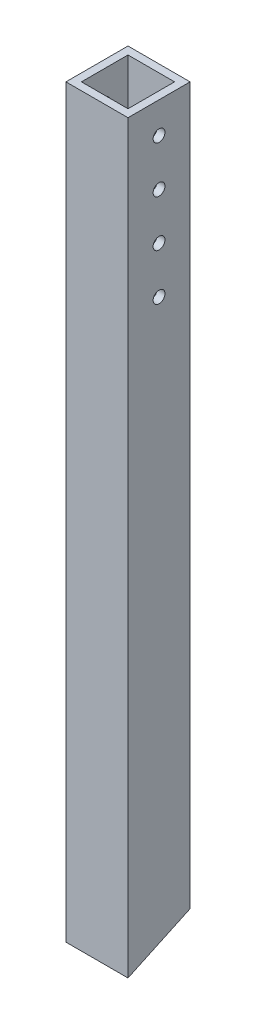
ISO-10303-21;
HEADER;
FILE_DESCRIPTION(('STEP AP214'),'2;1');
FILE_NAME('part.step','',(''),(''),'','','');
FILE_SCHEMA(('AUTOMOTIVE_DESIGN { 1 0 10303 214 1 1 1 1 }'));
ENDSEC;
DATA;
#1=APPLICATION_CONTEXT('core data for automotive mechanical design processes');
#2=APPLICATION_PROTOCOL_DEFINITION('international standard','automotive_design',2000,#1);
#3=PRODUCT_CONTEXT('',#1,'mechanical');
#4=PRODUCT('Part','Part','',(#3));
#5=PRODUCT_RELATED_PRODUCT_CATEGORY('part','',(#4));
#6=PRODUCT_DEFINITION_FORMATION('','',#4);
#7=PRODUCT_DEFINITION_CONTEXT('part definition',#1,'design');
#8=PRODUCT_DEFINITION('design','',#6,#7);
#9=PRODUCT_DEFINITION_SHAPE('','',#8);
#10=(LENGTH_UNIT() NAMED_UNIT(*) SI_UNIT(.MILLI.,.METRE.));
#11=(NAMED_UNIT(*) PLANE_ANGLE_UNIT() SI_UNIT($,.RADIAN.));
#12=(NAMED_UNIT(*) SI_UNIT($,.STERADIAN.) SOLID_ANGLE_UNIT());
#13=UNCERTAINTY_MEASURE_WITH_UNIT(LENGTH_MEASURE(1.E-05),#10,'distance_accuracy_value','');
#14=(GEOMETRIC_REPRESENTATION_CONTEXT(3) GLOBAL_UNCERTAINTY_ASSIGNED_CONTEXT((#13)) GLOBAL_UNIT_ASSIGNED_CONTEXT((#10,
#11,#12)) REPRESENTATION_CONTEXT('',''));
#15=CARTESIAN_POINT('',(0.,0.,0.));
#16=DIRECTION('',(0.,0.,1.));
#17=DIRECTION('',(1.,0.,0.));
#18=AXIS2_PLACEMENT_3D('',#15,#16,#17);
#19=CARTESIAN_POINT('',(12.7,304.8,-12.7));
#20=DIRECTION('',(0.,-1.,0.));
#21=DIRECTION('',(0.,0.,-1.));
#22=AXIS2_PLACEMENT_3D('',#19,#20,#21);
#23=PLANE('',#22);
#24=DIRECTION('',(0.,0.,-1.));
#25=VECTOR('',#24,1.);
#26=CARTESIAN_POINT('',(12.7,304.8,12.7));
#27=LINE('',#26,#25);
#28=CARTESIAN_POINT('',(12.7,304.8,12.7));
#29=VERTEX_POINT('',#28);
#30=CARTESIAN_POINT('',(12.7,304.8,-12.7));
#31=VERTEX_POINT('',#30);
#32=EDGE_CURVE('E192',#29,#31,#27,.T.);
#33=ORIENTED_EDGE('',*,*,#32,.T.);
#34=DIRECTION('',(-1.,0.,0.));
#35=VECTOR('',#34,1.);
#36=CARTESIAN_POINT('',(-12.7,304.8,-12.7));
#37=LINE('',#36,#35);
#38=CARTESIAN_POINT('',(-12.7,304.8,-12.7));
#39=VERTEX_POINT('',#38);
#40=EDGE_CURVE('E195',#31,#39,#37,.T.);
#41=ORIENTED_EDGE('',*,*,#40,.T.);
#42=DIRECTION('',(0.,0.,1.));
#43=VECTOR('',#42,1.);
#44=CARTESIAN_POINT('',(-12.7,304.8,12.7));
#45=LINE('',#44,#43);
#46=CARTESIAN_POINT('',(-12.7,304.8,12.7));
#47=VERTEX_POINT('',#46);
#48=EDGE_CURVE('E118',#39,#47,#45,.T.);
#49=ORIENTED_EDGE('',*,*,#48,.T.);
#50=DIRECTION('',(1.,0.,0.));
#51=VECTOR('',#50,1.);
#52=CARTESIAN_POINT('',(-12.7,304.8,12.7));
#53=LINE('',#52,#51);
#54=EDGE_CURVE('E198',#47,#29,#53,.T.);
#55=ORIENTED_EDGE('',*,*,#54,.T.);
#56=EDGE_LOOP('',(#33,#41,#49,#55));
#57=FACE_BOUND('',#56,.T.);
#58=DIRECTION('',(1.,0.,0.));
#59=VECTOR('',#58,1.);
#60=CARTESIAN_POINT('',(-9.525,304.8,9.525));
#61=LINE('',#60,#59);
#62=CARTESIAN_POINT('',(-9.525,304.8,9.525));
#63=VERTEX_POINT('',#62);
#64=CARTESIAN_POINT('',(9.525,304.8,9.525));
#65=VERTEX_POINT('',#64);
#66=EDGE_CURVE('E174',#63,#65,#61,.T.);
#67=ORIENTED_EDGE('',*,*,#66,.F.);
#68=DIRECTION('',(0.,0.,1.));
#69=VECTOR('',#68,1.);
#70=CARTESIAN_POINT('',(-9.525,304.8,9.525));
#71=LINE('',#70,#69);
#72=CARTESIAN_POINT('',(-9.525,304.8,-9.525));
#73=VERTEX_POINT('',#72);
#74=EDGE_CURVE('E180',#73,#63,#71,.T.);
#75=ORIENTED_EDGE('',*,*,#74,.F.);
#76=DIRECTION('',(-1.,0.,0.));
#77=VECTOR('',#76,1.);
#78=CARTESIAN_POINT('',(-9.525,304.8,-9.525));
#79=LINE('',#78,#77);
#80=CARTESIAN_POINT('',(9.525,304.8,-9.525));
#81=VERTEX_POINT('',#80);
#82=EDGE_CURVE('E178',#81,#73,#79,.T.);
#83=ORIENTED_EDGE('',*,*,#82,.F.);
#84=DIRECTION('',(0.,0.,-1.));
#85=VECTOR('',#84,1.);
#86=CARTESIAN_POINT('',(9.525,304.8,9.525));
#87=LINE('',#86,#85);
#88=EDGE_CURVE('E176',#65,#81,#87,.T.);
#89=ORIENTED_EDGE('',*,*,#88,.F.);
#90=EDGE_LOOP('',(#67,#75,#83,#89));
#91=FACE_BOUND('',#90,.T.);
#92=ADVANCED_FACE('F31',(#57,#91),#23,.F.);
#93=CARTESIAN_POINT('',(12.7,304.8,12.7));
#94=DIRECTION('',(-1.,0.,0.));
#95=DIRECTION('',(0.,0.,1.));
#96=AXIS2_PLACEMENT_3D('',#93,#94,#95);
#97=PLANE('',#96);
#98=CARTESIAN_POINT('',(12.7,234.95,0.));
#99=DIRECTION('',(1.,0.,0.));
#100=DIRECTION('',(0.,0.,-1.));
#101=AXIS2_PLACEMENT_3D('',#98,#99,#100);
#102=CIRCLE('',#101,2.41300000000001);
#103=CARTESIAN_POINT('',(12.7,234.95,-2.41300000000001));
#104=VERTEX_POINT('',#103);
#105=EDGE_CURVE('E257',#104,#104,#102,.T.);
#106=ORIENTED_EDGE('',*,*,#105,.F.);
#107=EDGE_LOOP('',(#106));
#108=FACE_BOUND('',#107,.T.);
#109=CARTESIAN_POINT('',(12.7,254.,0.));
#110=DIRECTION('',(1.,0.,0.));
#111=DIRECTION('',(0.,0.,-1.));
#112=AXIS2_PLACEMENT_3D('',#109,#110,#111);
#113=CIRCLE('',#112,2.41300000000001);
#114=CARTESIAN_POINT('',(12.7,254.,-2.41300000000001));
#115=VERTEX_POINT('',#114);
#116=EDGE_CURVE('E145',#115,#115,#113,.T.);
#117=ORIENTED_EDGE('',*,*,#116,.F.);
#118=EDGE_LOOP('',(#117));
#119=FACE_BOUND('',#118,.T.);
#120=CARTESIAN_POINT('',(12.7,273.05,0.));
#121=DIRECTION('',(1.,0.,0.));
#122=DIRECTION('',(0.,0.,-1.));
#123=AXIS2_PLACEMENT_3D('',#120,#121,#122);
#124=CIRCLE('',#123,2.41300000000001);
#125=CARTESIAN_POINT('',(12.7,273.05,-2.41300000000001));
#126=VERTEX_POINT('',#125);
#127=EDGE_CURVE('E142',#126,#126,#124,.T.);
#128=ORIENTED_EDGE('',*,*,#127,.F.);
#129=EDGE_LOOP('',(#128));
#130=FACE_BOUND('',#129,.T.);
#131=CARTESIAN_POINT('',(12.7,292.1,0.));
#132=DIRECTION('',(1.,0.,0.));
#133=DIRECTION('',(0.,0.,-1.));
#134=AXIS2_PLACEMENT_3D('',#131,#132,#133);
#135=CIRCLE('',#134,2.41300000000001);
#136=CARTESIAN_POINT('',(12.7,292.1,-2.41300000000001));
#137=VERTEX_POINT('',#136);
#138=EDGE_CURVE('E167',#137,#137,#135,.T.);
#139=ORIENTED_EDGE('',*,*,#138,.F.);
#140=EDGE_LOOP('',(#139));
#141=FACE_BOUND('',#140,.T.);
#142=DIRECTION('',(0.,-1.,0.));
#143=VECTOR('',#142,1.);
#144=CARTESIAN_POINT('',(12.7,304.8,12.7));
#145=LINE('',#144,#143);
#146=CARTESIAN_POINT('',(12.7,0.,12.7));
#147=VERTEX_POINT('',#146);
#148=EDGE_CURVE('E122',#29,#147,#145,.T.);
#149=ORIENTED_EDGE('',*,*,#148,.T.);
#150=DIRECTION('',(0.,-0.422618261740695,0.906307787036652));
#151=VECTOR('',#150,1.);
#152=CARTESIAN_POINT('',(12.7,0.,12.7));
#153=LINE('',#152,#151);
#154=CARTESIAN_POINT('',(12.7,11.8442145171368,-12.7));
#155=VERTEX_POINT('',#154);
#156=EDGE_CURVE('E107',#155,#147,#153,.T.);
#157=ORIENTED_EDGE('',*,*,#156,.F.);
#158=DIRECTION('',(0.,-1.,0.));
#159=VECTOR('',#158,1.);
#160=CARTESIAN_POINT('',(12.7,304.8,-12.7));
#161=LINE('',#160,#159);
#162=EDGE_CURVE('E40',#31,#155,#161,.T.);
#163=ORIENTED_EDGE('',*,*,#162,.F.);
#164=ORIENTED_EDGE('',*,*,#32,.F.);
#165=EDGE_LOOP('',(#149,#157,#163,#164));
#166=FACE_BOUND('',#165,.T.);
#167=ADVANCED_FACE('F33',(#108,#119,#130,#141,#166),#97,.F.);
#168=CARTESIAN_POINT('',(-12.7,304.8,-12.7));
#169=DIRECTION('',(0.,0.,1.));
#170=DIRECTION('',(1.,0.,0.));
#171=AXIS2_PLACEMENT_3D('',#168,#169,#170);
#172=PLANE('',#171);
#173=ORIENTED_EDGE('',*,*,#162,.T.);
#174=DIRECTION('',(1.,0.,0.));
#175=VECTOR('',#174,1.);
#176=CARTESIAN_POINT('',(-12.7,11.8442145171368,-12.7));
#177=LINE('',#176,#175);
#178=CARTESIAN_POINT('',(-12.7,11.8442145171368,-12.7));
#179=VERTEX_POINT('',#178);
#180=EDGE_CURVE('E99',#179,#155,#177,.T.);
#181=ORIENTED_EDGE('',*,*,#180,.F.);
#182=DIRECTION('',(0.,-1.,0.));
#183=VECTOR('',#182,1.);
#184=CARTESIAN_POINT('',(-12.7,304.8,-12.7));
#185=LINE('',#184,#183);
#186=EDGE_CURVE('E113',#39,#179,#185,.T.);
#187=ORIENTED_EDGE('',*,*,#186,.F.);
#188=ORIENTED_EDGE('',*,*,#40,.F.);
#189=EDGE_LOOP('',(#173,#181,#187,#188));
#190=FACE_BOUND('',#189,.T.);
#191=ADVANCED_FACE('F112',(#190),#172,.F.);
#192=CARTESIAN_POINT('',(-12.7,304.8,12.7));
#193=DIRECTION('',(1.,0.,0.));
#194=DIRECTION('',(0.,0.,-1.));
#195=AXIS2_PLACEMENT_3D('',#192,#193,#194);
#196=PLANE('',#195);
#197=CARTESIAN_POINT('',(-12.7,234.95,0.));
#198=DIRECTION('',(1.,0.,0.));
#199=DIRECTION('',(0.,0.,-1.));
#200=AXIS2_PLACEMENT_3D('',#197,#198,#199);
#201=CIRCLE('',#200,2.41300000000001);
#202=CARTESIAN_POINT('',(-12.7,234.95,-2.41300000000001));
#203=VERTEX_POINT('',#202);
#204=EDGE_CURVE('E298',#203,#203,#201,.T.);
#205=ORIENTED_EDGE('',*,*,#204,.T.);
#206=EDGE_LOOP('',(#205));
#207=FACE_BOUND('',#206,.T.);
#208=CARTESIAN_POINT('',(-12.7,254.,0.));
#209=DIRECTION('',(1.,0.,0.));
#210=DIRECTION('',(0.,0.,-1.));
#211=AXIS2_PLACEMENT_3D('',#208,#209,#210);
#212=CIRCLE('',#211,2.41300000000001);
#213=CARTESIAN_POINT('',(-12.7,254.,-2.41300000000001));
#214=VERTEX_POINT('',#213);
#215=EDGE_CURVE('E138',#214,#214,#212,.T.);
#216=ORIENTED_EDGE('',*,*,#215,.T.);
#217=EDGE_LOOP('',(#216));
#218=FACE_BOUND('',#217,.T.);
#219=CARTESIAN_POINT('',(-12.7,273.05,0.));
#220=DIRECTION('',(1.,0.,0.));
#221=DIRECTION('',(0.,0.,-1.));
#222=AXIS2_PLACEMENT_3D('',#219,#220,#221);
#223=CIRCLE('',#222,2.41300000000001);
#224=CARTESIAN_POINT('',(-12.7,273.05,-2.41300000000001));
#225=VERTEX_POINT('',#224);
#226=EDGE_CURVE('E134',#225,#225,#223,.T.);
#227=ORIENTED_EDGE('',*,*,#226,.T.);
#228=EDGE_LOOP('',(#227));
#229=FACE_BOUND('',#228,.T.);
#230=CARTESIAN_POINT('',(-12.7,292.1,0.));
#231=DIRECTION('',(1.,0.,0.));
#232=DIRECTION('',(0.,0.,-1.));
#233=AXIS2_PLACEMENT_3D('',#230,#231,#232);
#234=CIRCLE('',#233,2.41300000000001);
#235=CARTESIAN_POINT('',(-12.7,292.1,-2.41300000000001));
#236=VERTEX_POINT('',#235);
#237=EDGE_CURVE('E129',#236,#236,#234,.T.);
#238=ORIENTED_EDGE('',*,*,#237,.T.);
#239=EDGE_LOOP('',(#238));
#240=FACE_BOUND('',#239,.T.);
#241=ORIENTED_EDGE('',*,*,#186,.T.);
#242=DIRECTION('',(0.,-0.422618261740695,0.906307787036652));
#243=VECTOR('',#242,1.);
#244=CARTESIAN_POINT('',(-12.7,0.,12.7));
#245=LINE('',#244,#243);
#246=CARTESIAN_POINT('',(-12.7,0.,12.7));
#247=VERTEX_POINT('',#246);
#248=EDGE_CURVE('E96',#179,#247,#245,.T.);
#249=ORIENTED_EDGE('',*,*,#248,.T.);
#250=DIRECTION('',(0.,-1.,0.));
#251=VECTOR('',#250,1.);
#252=CARTESIAN_POINT('',(-12.7,304.8,12.7));
#253=LINE('',#252,#251);
#254=EDGE_CURVE('E119',#47,#247,#253,.T.);
#255=ORIENTED_EDGE('',*,*,#254,.F.);
#256=ORIENTED_EDGE('',*,*,#48,.F.);
#257=EDGE_LOOP('',(#241,#249,#255,#256));
#258=FACE_BOUND('',#257,.T.);
#259=ADVANCED_FACE('F117',(#207,#218,#229,#240,#258),#196,.F.);
#260=CARTESIAN_POINT('',(-12.7,304.8,12.7));
#261=DIRECTION('',(0.,0.,-1.));
#262=DIRECTION('',(-1.,0.,0.));
#263=AXIS2_PLACEMENT_3D('',#260,#261,#262);
#264=PLANE('',#263);
#265=DIRECTION('',(1.,0.,0.));
#266=VECTOR('',#265,1.);
#267=CARTESIAN_POINT('',(-12.7,0.,12.7));
#268=LINE('',#267,#266);
#269=EDGE_CURVE('E102',#247,#147,#268,.T.);
#270=ORIENTED_EDGE('',*,*,#269,.T.);
#271=ORIENTED_EDGE('',*,*,#148,.F.);
#272=ORIENTED_EDGE('',*,*,#54,.F.);
#273=ORIENTED_EDGE('',*,*,#254,.T.);
#274=EDGE_LOOP('',(#270,#271,#272,#273));
#275=FACE_BOUND('',#274,.T.);
#276=ADVANCED_FACE('F206',(#275),#264,.F.);
#277=CARTESIAN_POINT('',(-9.525,304.8,9.525));
#278=DIRECTION('',(0.,0.,-1.));
#279=DIRECTION('',(-1.,0.,0.));
#280=AXIS2_PLACEMENT_3D('',#277,#278,#279);
#281=PLANE('',#280);
#282=DIRECTION('',(1.,0.,0.));
#283=VECTOR('',#282,1.);
#284=CARTESIAN_POINT('',(-9.525,1.48052681464211,9.525));
#285=LINE('',#284,#283);
#286=CARTESIAN_POINT('',(-9.525,1.48052681464209,9.52500000000001));
#287=VERTEX_POINT('',#286);
#288=CARTESIAN_POINT('',(9.525,1.48052681464209,9.52500000000001));
#289=VERTEX_POINT('',#288);
#290=EDGE_CURVE('E165',#287,#289,#285,.T.);
#291=ORIENTED_EDGE('',*,*,#290,.F.);
#292=DIRECTION('',(0.,-1.,0.));
#293=VECTOR('',#292,1.);
#294=CARTESIAN_POINT('',(-9.525,304.8,9.525));
#295=LINE('',#294,#293);
#296=EDGE_CURVE('E182',#63,#287,#295,.T.);
#297=ORIENTED_EDGE('',*,*,#296,.F.);
#298=ORIENTED_EDGE('',*,*,#66,.T.);
#299=DIRECTION('',(0.,-1.,0.));
#300=VECTOR('',#299,1.);
#301=CARTESIAN_POINT('',(9.525,304.8,9.525));
#302=LINE('',#301,#300);
#303=EDGE_CURVE('E189',#65,#289,#302,.T.);
#304=ORIENTED_EDGE('',*,*,#303,.T.);
#305=EDGE_LOOP('',(#291,#297,#298,#304));
#306=FACE_BOUND('',#305,.T.);
#307=ADVANCED_FACE('F219',(#306),#281,.T.);
#308=CARTESIAN_POINT('',(9.525,304.8,9.525));
#309=DIRECTION('',(-1.,0.,0.));
#310=DIRECTION('',(0.,0.,1.));
#311=AXIS2_PLACEMENT_3D('',#308,#309,#310);
#312=PLANE('',#311);
#313=CARTESIAN_POINT('',(9.525,234.95,0.));
#314=DIRECTION('',(-1.,0.,0.));
#315=DIRECTION('',(0.,0.,1.));
#316=AXIS2_PLACEMENT_3D('',#313,#314,#315);
#317=CIRCLE('',#316,2.41300000000001);
#318=CARTESIAN_POINT('',(9.525,234.95,2.41300000000002));
#319=VERTEX_POINT('',#318);
#320=EDGE_CURVE('E150',#319,#319,#317,.T.);
#321=ORIENTED_EDGE('',*,*,#320,.F.);
#322=EDGE_LOOP('',(#321));
#323=FACE_BOUND('',#322,.T.);
#324=CARTESIAN_POINT('',(9.525,254.,0.));
#325=DIRECTION('',(-1.,0.,0.));
#326=DIRECTION('',(0.,0.,1.));
#327=AXIS2_PLACEMENT_3D('',#324,#325,#326);
#328=CIRCLE('',#327,2.41300000000001);
#329=CARTESIAN_POINT('',(9.525,254.,2.41300000000002));
#330=VERTEX_POINT('',#329);
#331=EDGE_CURVE('E137',#330,#330,#328,.T.);
#332=ORIENTED_EDGE('',*,*,#331,.F.);
#333=EDGE_LOOP('',(#332));
#334=FACE_BOUND('',#333,.T.);
#335=CARTESIAN_POINT('',(9.525,273.05,0.));
#336=DIRECTION('',(-1.,0.,0.));
#337=DIRECTION('',(0.,0.,1.));
#338=AXIS2_PLACEMENT_3D('',#335,#336,#337);
#339=CIRCLE('',#338,2.41300000000001);
#340=CARTESIAN_POINT('',(9.525,273.05,2.41300000000001));
#341=VERTEX_POINT('',#340);
#342=EDGE_CURVE('E133',#341,#341,#339,.T.);
#343=ORIENTED_EDGE('',*,*,#342,.F.);
#344=EDGE_LOOP('',(#343));
#345=FACE_BOUND('',#344,.T.);
#346=DIRECTION('',(0.,0.422618261740695,-0.906307787036652));
#347=VECTOR('',#346,1.);
#348=CARTESIAN_POINT('',(9.525,55.6552638372215,-106.653098461709));
#349=LINE('',#348,#347);
#350=CARTESIAN_POINT('',(9.525,10.3636877024947,-9.525));
#351=VERTEX_POINT('',#350);
#352=EDGE_CURVE('E163',#289,#351,#349,.T.);
#353=ORIENTED_EDGE('',*,*,#352,.F.);
#354=ORIENTED_EDGE('',*,*,#303,.F.);
#355=ORIENTED_EDGE('',*,*,#88,.T.);
#356=DIRECTION('',(0.,-1.,0.));
#357=VECTOR('',#356,1.);
#358=CARTESIAN_POINT('',(9.525,304.8,-9.525));
#359=LINE('',#358,#357);
#360=EDGE_CURVE('E186',#81,#351,#359,.T.);
#361=ORIENTED_EDGE('',*,*,#360,.T.);
#362=EDGE_LOOP('',(#353,#354,#355,#361));
#363=FACE_BOUND('',#362,.T.);
#364=CARTESIAN_POINT('',(9.525,292.1,0.));
#365=DIRECTION('',(-1.,0.,0.));
#366=DIRECTION('',(0.,0.,1.));
#367=AXIS2_PLACEMENT_3D('',#364,#365,#366);
#368=CIRCLE('',#367,2.41300000000001);
#369=CARTESIAN_POINT('',(9.525,292.1,2.41300000000001));
#370=VERTEX_POINT('',#369);
#371=EDGE_CURVE('E128',#370,#370,#368,.T.);
#372=ORIENTED_EDGE('',*,*,#371,.F.);
#373=EDGE_LOOP('',(#372));
#374=FACE_BOUND('',#373,.T.);
#375=ADVANCED_FACE('F222',(#323,#334,#345,#363,#374),#312,.T.);
#376=CARTESIAN_POINT('',(-9.525,304.8,-9.525));
#377=DIRECTION('',(0.,0.,1.));
#378=DIRECTION('',(1.,0.,0.));
#379=AXIS2_PLACEMENT_3D('',#376,#377,#378);
#380=PLANE('',#379);
#381=DIRECTION('',(-1.,0.,0.));
#382=VECTOR('',#381,1.);
#383=CARTESIAN_POINT('',(-9.525,10.3636877024947,-9.525));
#384=LINE('',#383,#382);
#385=CARTESIAN_POINT('',(-9.525,10.3636877024948,-9.52500000000002));
#386=VERTEX_POINT('',#385);
#387=EDGE_CURVE('E47',#351,#386,#384,.T.);
#388=ORIENTED_EDGE('',*,*,#387,.F.);
#389=ORIENTED_EDGE('',*,*,#360,.F.);
#390=ORIENTED_EDGE('',*,*,#82,.T.);
#391=DIRECTION('',(0.,-1.,0.));
#392=VECTOR('',#391,1.);
#393=CARTESIAN_POINT('',(-9.525,304.8,-9.525));
#394=LINE('',#393,#392);
#395=EDGE_CURVE('E54',#73,#386,#394,.T.);
#396=ORIENTED_EDGE('',*,*,#395,.T.);
#397=EDGE_LOOP('',(#388,#389,#390,#396));
#398=FACE_BOUND('',#397,.T.);
#399=ADVANCED_FACE('F226',(#398),#380,.T.);
#400=CARTESIAN_POINT('',(-9.525,304.8,9.525));
#401=DIRECTION('',(1.,0.,0.));
#402=DIRECTION('',(0.,0.,-1.));
#403=AXIS2_PLACEMENT_3D('',#400,#401,#402);
#404=PLANE('',#403);
#405=CARTESIAN_POINT('',(-9.525,234.95,0.));
#406=DIRECTION('',(1.,0.,0.));
#407=DIRECTION('',(0.,0.,-1.));
#408=AXIS2_PLACEMENT_3D('',#405,#406,#407);
#409=CIRCLE('',#408,2.41300000000001);
#410=CARTESIAN_POINT('',(-9.525,234.95,-2.41300000000001));
#411=VERTEX_POINT('',#410);
#412=EDGE_CURVE('E35',#411,#411,#409,.T.);
#413=ORIENTED_EDGE('',*,*,#412,.F.);
#414=EDGE_LOOP('',(#413));
#415=FACE_BOUND('',#414,.T.);
#416=CARTESIAN_POINT('',(-9.525,254.,0.));
#417=DIRECTION('',(1.,0.,0.));
#418=DIRECTION('',(0.,0.,-1.));
#419=AXIS2_PLACEMENT_3D('',#416,#417,#418);
#420=CIRCLE('',#419,2.41300000000001);
#421=CARTESIAN_POINT('',(-9.525,254.,-2.41300000000001));
#422=VERTEX_POINT('',#421);
#423=EDGE_CURVE('E135',#422,#422,#420,.T.);
#424=ORIENTED_EDGE('',*,*,#423,.F.);
#425=EDGE_LOOP('',(#424));
#426=FACE_BOUND('',#425,.T.);
#427=CARTESIAN_POINT('',(-9.525,273.05,0.));
#428=DIRECTION('',(1.,0.,0.));
#429=DIRECTION('',(0.,0.,-1.));
#430=AXIS2_PLACEMENT_3D('',#427,#428,#429);
#431=CIRCLE('',#430,2.41300000000001);
#432=CARTESIAN_POINT('',(-9.525,273.05,-2.41300000000001));
#433=VERTEX_POINT('',#432);
#434=EDGE_CURVE('E131',#433,#433,#431,.T.);
#435=ORIENTED_EDGE('',*,*,#434,.F.);
#436=EDGE_LOOP('',(#435));
#437=FACE_BOUND('',#436,.T.);
#438=DIRECTION('',(0.,-0.422618261740695,0.906307787036652));
#439=VECTOR('',#438,1.);
#440=CARTESIAN_POINT('',(-9.525,55.6552638372215,-106.653098461709));
#441=LINE('',#440,#439);
#442=EDGE_CURVE('E11',#386,#287,#441,.T.);
#443=ORIENTED_EDGE('',*,*,#442,.F.);
#444=ORIENTED_EDGE('',*,*,#395,.F.);
#445=ORIENTED_EDGE('',*,*,#74,.T.);
#446=ORIENTED_EDGE('',*,*,#296,.T.);
#447=EDGE_LOOP('',(#443,#444,#445,#446));
#448=FACE_BOUND('',#447,.T.);
#449=CARTESIAN_POINT('',(-9.525,292.1,0.));
#450=DIRECTION('',(1.,0.,0.));
#451=DIRECTION('',(0.,0.,-1.));
#452=AXIS2_PLACEMENT_3D('',#449,#450,#451);
#453=CIRCLE('',#452,2.41300000000001);
#454=CARTESIAN_POINT('',(-9.525,292.1,-2.41300000000001));
#455=VERTEX_POINT('',#454);
#456=EDGE_CURVE('E126',#455,#455,#453,.T.);
#457=ORIENTED_EDGE('',*,*,#456,.F.);
#458=EDGE_LOOP('',(#457));
#459=FACE_BOUND('',#458,.T.);
#460=ADVANCED_FACE('F228',(#415,#426,#437,#448,#459),#404,.T.);
#461=CARTESIAN_POINT('',(-12.7,292.1,0.));
#462=DIRECTION('',(1.,0.,0.));
#463=DIRECTION('',(0.,0.,-1.));
#464=AXIS2_PLACEMENT_3D('',#461,#462,#463);
#465=CYLINDRICAL_SURFACE('',#464,2.41300000000001);
#466=ORIENTED_EDGE('',*,*,#456,.T.);
#467=EDGE_LOOP('',(#466));
#468=FACE_BOUND('',#467,.T.);
#469=ORIENTED_EDGE('',*,*,#237,.F.);
#470=EDGE_LOOP('',(#469));
#471=FACE_BOUND('',#470,.T.);
#472=ADVANCED_FACE('F234',(#468,#471),#465,.F.);
#473=ORIENTED_EDGE('',*,*,#371,.T.);
#474=EDGE_LOOP('',(#473));
#475=FACE_BOUND('',#474,.T.);
#476=ORIENTED_EDGE('',*,*,#138,.T.);
#477=EDGE_LOOP('',(#476));
#478=FACE_BOUND('',#477,.T.);
#479=ADVANCED_FACE('F264',(#475,#478),#465,.F.);
#480=CARTESIAN_POINT('',(-12.7,0.,12.7));
#481=DIRECTION('',(0.,0.906307787036652,0.422618261740695));
#482=DIRECTION('',(0.,-0.422618261740695,0.906307787036652));
#483=AXIS2_PLACEMENT_3D('',#480,#481,#482);
#484=PLANE('',#483);
#485=ORIENTED_EDGE('',*,*,#290,.T.);
#486=ORIENTED_EDGE('',*,*,#352,.T.);
#487=ORIENTED_EDGE('',*,*,#387,.T.);
#488=ORIENTED_EDGE('',*,*,#442,.T.);
#489=EDGE_LOOP('',(#485,#486,#487,#488));
#490=FACE_BOUND('',#489,.T.);
#491=ORIENTED_EDGE('',*,*,#156,.T.);
#492=ORIENTED_EDGE('',*,*,#269,.F.);
#493=ORIENTED_EDGE('',*,*,#248,.F.);
#494=ORIENTED_EDGE('',*,*,#180,.T.);
#495=EDGE_LOOP('',(#491,#492,#493,#494));
#496=FACE_BOUND('',#495,.T.);
#497=ADVANCED_FACE('F98',(#490,#496),#484,.F.);
#498=CARTESIAN_POINT('',(-12.7,273.05,0.));
#499=DIRECTION('',(1.,0.,0.));
#500=DIRECTION('',(0.,0.,-1.));
#501=AXIS2_PLACEMENT_3D('',#498,#499,#500);
#502=CYLINDRICAL_SURFACE('',#501,2.41300000000001);
#503=ORIENTED_EDGE('',*,*,#434,.T.);
#504=EDGE_LOOP('',(#503));
#505=FACE_BOUND('',#504,.T.);
#506=ORIENTED_EDGE('',*,*,#226,.F.);
#507=EDGE_LOOP('',(#506));
#508=FACE_BOUND('',#507,.T.);
#509=ADVANCED_FACE('F271',(#505,#508),#502,.F.);
#510=ORIENTED_EDGE('',*,*,#342,.T.);
#511=EDGE_LOOP('',(#510));
#512=FACE_BOUND('',#511,.T.);
#513=ORIENTED_EDGE('',*,*,#127,.T.);
#514=EDGE_LOOP('',(#513));
#515=FACE_BOUND('',#514,.T.);
#516=ADVANCED_FACE('F277',(#512,#515),#502,.F.);
#517=CARTESIAN_POINT('',(-12.7,254.,0.));
#518=DIRECTION('',(1.,0.,0.));
#519=DIRECTION('',(0.,0.,-1.));
#520=AXIS2_PLACEMENT_3D('',#517,#518,#519);
#521=CYLINDRICAL_SURFACE('',#520,2.41300000000001);
#522=ORIENTED_EDGE('',*,*,#423,.T.);
#523=EDGE_LOOP('',(#522));
#524=FACE_BOUND('',#523,.T.);
#525=ORIENTED_EDGE('',*,*,#215,.F.);
#526=EDGE_LOOP('',(#525));
#527=FACE_BOUND('',#526,.T.);
#528=ADVANCED_FACE('F279',(#524,#527),#521,.F.);
#529=ORIENTED_EDGE('',*,*,#331,.T.);
#530=EDGE_LOOP('',(#529));
#531=FACE_BOUND('',#530,.T.);
#532=ORIENTED_EDGE('',*,*,#116,.T.);
#533=EDGE_LOOP('',(#532));
#534=FACE_BOUND('',#533,.T.);
#535=ADVANCED_FACE('F282',(#531,#534),#521,.F.);
#536=CARTESIAN_POINT('',(-12.7,234.95,0.));
#537=DIRECTION('',(1.,0.,0.));
#538=DIRECTION('',(0.,0.,-1.));
#539=AXIS2_PLACEMENT_3D('',#536,#537,#538);
#540=CYLINDRICAL_SURFACE('',#539,2.41300000000001);
#541=ORIENTED_EDGE('',*,*,#412,.T.);
#542=EDGE_LOOP('',(#541));
#543=FACE_BOUND('',#542,.T.);
#544=ORIENTED_EDGE('',*,*,#204,.F.);
#545=EDGE_LOOP('',(#544));
#546=FACE_BOUND('',#545,.T.);
#547=ADVANCED_FACE('F283',(#543,#546),#540,.F.);
#548=ORIENTED_EDGE('',*,*,#320,.T.);
#549=EDGE_LOOP('',(#548));
#550=FACE_BOUND('',#549,.T.);
#551=ORIENTED_EDGE('',*,*,#105,.T.);
#552=EDGE_LOOP('',(#551));
#553=FACE_BOUND('',#552,.T.);
#554=ADVANCED_FACE('F285',(#550,#553),#540,.F.);
#555=CLOSED_SHELL('',(#92,#167,#191,#259,#276,#307,#375,#399,#460,#472,#479,#497,#509,#516,#528,
#535,#547,#554));
#556=MANIFOLD_SOLID_BREP('B2',#555);
#557=ADVANCED_BREP_SHAPE_REPRESENTATION('',(#18,#556),#14);
#558=SHAPE_DEFINITION_REPRESENTATION(#9,#557);
ENDSEC;
END-ISO-10303-21;
